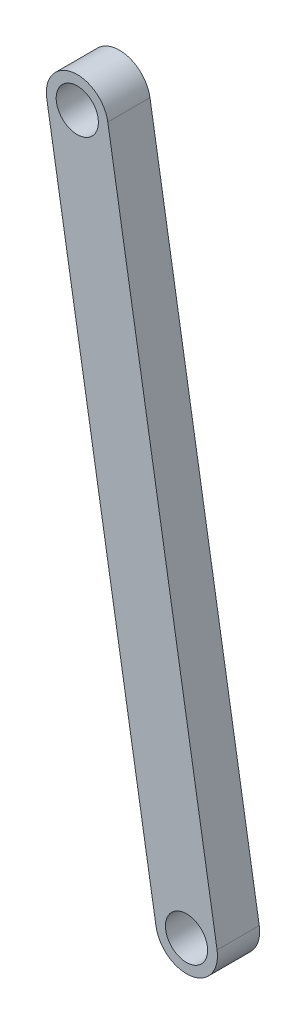
ISO-10303-21;
HEADER;
FILE_DESCRIPTION(('STEP AP214'),'2;1');
FILE_NAME('part.step','',(''),(''),'','','');
FILE_SCHEMA(('AUTOMOTIVE_DESIGN { 1 0 10303 214 1 1 1 1 }'));
ENDSEC;
DATA;
#1=APPLICATION_CONTEXT('core data for automotive mechanical design processes');
#2=APPLICATION_PROTOCOL_DEFINITION('international standard','automotive_design',2000,#1);
#3=PRODUCT_CONTEXT('',#1,'mechanical');
#4=PRODUCT('Part','Part','',(#3));
#5=PRODUCT_RELATED_PRODUCT_CATEGORY('part','',(#4));
#6=PRODUCT_DEFINITION_FORMATION('','',#4);
#7=PRODUCT_DEFINITION_CONTEXT('part definition',#1,'design');
#8=PRODUCT_DEFINITION('design','',#6,#7);
#9=PRODUCT_DEFINITION_SHAPE('','',#8);
#10=(LENGTH_UNIT() NAMED_UNIT(*) SI_UNIT(.MILLI.,.METRE.));
#11=(NAMED_UNIT(*) PLANE_ANGLE_UNIT() SI_UNIT($,.RADIAN.));
#12=(NAMED_UNIT(*) SI_UNIT($,.STERADIAN.) SOLID_ANGLE_UNIT());
#13=UNCERTAINTY_MEASURE_WITH_UNIT(LENGTH_MEASURE(1.E-05),#10,'distance_accuracy_value','');
#14=(GEOMETRIC_REPRESENTATION_CONTEXT(3) GLOBAL_UNCERTAINTY_ASSIGNED_CONTEXT((#13)) GLOBAL_UNIT_ASSIGNED_CONTEXT((#10,
#11,#12)) REPRESENTATION_CONTEXT('',''));
#15=CARTESIAN_POINT('',(0.,0.,0.));
#16=DIRECTION('',(0.,0.,1.));
#17=DIRECTION('',(1.,0.,0.));
#18=AXIS2_PLACEMENT_3D('',#15,#16,#17);
#19=CARTESIAN_POINT('',(0.,0.,3.));
#20=DIRECTION('',(0.,0.,1.));
#21=DIRECTION('',(1.,0.,0.));
#22=AXIS2_PLACEMENT_3D('',#19,#20,#21);
#23=PLANE('',#22);
#24=CARTESIAN_POINT('',(0.,0.,3.));
#25=DIRECTION('',(0.,0.,1.));
#26=DIRECTION('',(1.,0.,0.));
#27=AXIS2_PLACEMENT_3D('',#24,#25,#26);
#28=CIRCLE('',#27,1.5);
#29=CARTESIAN_POINT('',(1.5,0.,3.));
#30=VERTEX_POINT('',#29);
#31=EDGE_CURVE('E108',#30,#30,#28,.T.);
#32=ORIENTED_EDGE('',*,*,#31,.F.);
#33=EDGE_LOOP('',(#32));
#34=FACE_BOUND('',#33,.T.);
#35=CARTESIAN_POINT('',(0.,0.,3.));
#36=DIRECTION('',(0.,0.,1.));
#37=DIRECTION('',(1.,0.,0.));
#38=AXIS2_PLACEMENT_3D('',#35,#36,#37);
#39=CIRCLE('',#38,2.2);
#40=CARTESIAN_POINT('',(2.17066154290129,0.358090025230214,3.));
#41=VERTEX_POINT('',#40);
#42=CARTESIAN_POINT('',(-2.1706615429013,-0.358090025230214,3.));
#43=VERTEX_POINT('',#42);
#44=EDGE_CURVE('E93',#41,#43,#39,.T.);
#45=ORIENTED_EDGE('',*,*,#44,.T.);
#46=DIRECTION('',(0.162768193286461,-0.986664337682406,0.));
#47=VECTOR('',#46,1.);
#48=CARTESIAN_POINT('',(-2.1706615429013,-0.358090025230214,3.));
#49=LINE('',#48,#47);
#50=CARTESIAN_POINT('',(5.59933845709871,-47.4580900252302,3.));
#51=VERTEX_POINT('',#50);
#52=EDGE_CURVE('E88',#43,#51,#49,.T.);
#53=ORIENTED_EDGE('',*,*,#52,.T.);
#54=CARTESIAN_POINT('',(7.77000000000001,-47.1,3.));
#55=DIRECTION('',(0.,0.,1.));
#56=DIRECTION('',(1.,0.,0.));
#57=AXIS2_PLACEMENT_3D('',#54,#55,#56);
#58=CIRCLE('',#57,2.2);
#59=CARTESIAN_POINT('',(9.9406615429013,-46.7419099747698,3.));
#60=VERTEX_POINT('',#59);
#61=EDGE_CURVE('E91',#51,#60,#58,.T.);
#62=ORIENTED_EDGE('',*,*,#61,.T.);
#63=DIRECTION('',(-0.162768193286461,0.986664337682406,0.));
#64=VECTOR('',#63,1.);
#65=CARTESIAN_POINT('',(2.17066154290129,0.358090025230214,3.));
#66=LINE('',#65,#64);
#67=EDGE_CURVE('E58',#60,#41,#66,.T.);
#68=ORIENTED_EDGE('',*,*,#67,.T.);
#69=EDGE_LOOP('',(#45,#53,#62,#68));
#70=FACE_BOUND('',#69,.T.);
#71=CARTESIAN_POINT('',(7.77000000000001,-47.1,3.));
#72=DIRECTION('',(0.,0.,1.));
#73=DIRECTION('',(1.,0.,0.));
#74=AXIS2_PLACEMENT_3D('',#71,#72,#73);
#75=CIRCLE('',#74,1.5);
#76=CARTESIAN_POINT('',(9.27000000000001,-47.1,3.));
#77=VERTEX_POINT('',#76);
#78=EDGE_CURVE('E123',#77,#77,#75,.T.);
#79=ORIENTED_EDGE('',*,*,#78,.F.);
#80=EDGE_LOOP('',(#79));
#81=FACE_BOUND('',#80,.T.);
#82=ADVANCED_FACE('F41',(#34,#70,#81),#23,.T.);
#83=CARTESIAN_POINT('',(0.,0.,0.));
#84=DIRECTION('',(0.,0.,1.));
#85=DIRECTION('',(1.,0.,0.));
#86=AXIS2_PLACEMENT_3D('',#83,#84,#85);
#87=PLANE('',#86);
#88=CARTESIAN_POINT('',(0.,0.,0.));
#89=DIRECTION('',(0.,0.,1.));
#90=DIRECTION('',(1.,0.,0.));
#91=AXIS2_PLACEMENT_3D('',#88,#89,#90);
#92=CIRCLE('',#91,2.2);
#93=CARTESIAN_POINT('',(2.17066154290129,0.358090025230214,0.));
#94=VERTEX_POINT('',#93);
#95=CARTESIAN_POINT('',(-2.1706615429013,-0.358090025230214,0.));
#96=VERTEX_POINT('',#95);
#97=EDGE_CURVE('E105',#94,#96,#92,.T.);
#98=ORIENTED_EDGE('',*,*,#97,.F.);
#99=DIRECTION('',(-0.162768193286461,0.986664337682406,0.));
#100=VECTOR('',#99,1.);
#101=CARTESIAN_POINT('',(2.17066154290129,0.358090025230214,0.));
#102=LINE('',#101,#100);
#103=CARTESIAN_POINT('',(9.9406615429013,-46.7419099747698,0.));
#104=VERTEX_POINT('',#103);
#105=EDGE_CURVE('E81',#104,#94,#102,.T.);
#106=ORIENTED_EDGE('',*,*,#105,.F.);
#107=CARTESIAN_POINT('',(7.77000000000001,-47.1,0.));
#108=DIRECTION('',(0.,0.,1.));
#109=DIRECTION('',(1.,0.,0.));
#110=AXIS2_PLACEMENT_3D('',#107,#108,#109);
#111=CIRCLE('',#110,2.2);
#112=CARTESIAN_POINT('',(5.59933845709871,-47.4580900252302,0.));
#113=VERTEX_POINT('',#112);
#114=EDGE_CURVE('E75',#113,#104,#111,.T.);
#115=ORIENTED_EDGE('',*,*,#114,.F.);
#116=DIRECTION('',(0.162768193286461,-0.986664337682406,0.));
#117=VECTOR('',#116,1.);
#118=CARTESIAN_POINT('',(-2.1706615429013,-0.358090025230214,0.));
#119=LINE('',#118,#117);
#120=EDGE_CURVE('E97',#96,#113,#119,.T.);
#121=ORIENTED_EDGE('',*,*,#120,.F.);
#122=EDGE_LOOP('',(#98,#106,#115,#121));
#123=FACE_BOUND('',#122,.T.);
#124=CARTESIAN_POINT('',(0.,0.,0.));
#125=DIRECTION('',(0.,0.,1.));
#126=DIRECTION('',(1.,0.,0.));
#127=AXIS2_PLACEMENT_3D('',#124,#125,#126);
#128=CIRCLE('',#127,1.5);
#129=CARTESIAN_POINT('',(1.5,0.,0.));
#130=VERTEX_POINT('',#129);
#131=EDGE_CURVE('E120',#130,#130,#128,.T.);
#132=ORIENTED_EDGE('',*,*,#131,.T.);
#133=EDGE_LOOP('',(#132));
#134=FACE_BOUND('',#133,.T.);
#135=CARTESIAN_POINT('',(7.77000000000001,-47.1,0.));
#136=DIRECTION('',(0.,0.,1.));
#137=DIRECTION('',(1.,0.,0.));
#138=AXIS2_PLACEMENT_3D('',#135,#136,#137);
#139=CIRCLE('',#138,1.5);
#140=CARTESIAN_POINT('',(9.27000000000001,-47.1,0.));
#141=VERTEX_POINT('',#140);
#142=EDGE_CURVE('E126',#141,#141,#139,.T.);
#143=ORIENTED_EDGE('',*,*,#142,.T.);
#144=EDGE_LOOP('',(#143));
#145=FACE_BOUND('',#144,.T.);
#146=ADVANCED_FACE('F116',(#123,#134,#145),#87,.F.);
#147=CARTESIAN_POINT('',(0.,0.,3.));
#148=DIRECTION('',(0.,0.,-1.));
#149=DIRECTION('',(-1.,0.,0.));
#150=AXIS2_PLACEMENT_3D('',#147,#148,#149);
#151=CYLINDRICAL_SURFACE('',#150,2.2);
#152=ORIENTED_EDGE('',*,*,#97,.T.);
#153=DIRECTION('',(0.,0.,-1.));
#154=VECTOR('',#153,1.);
#155=CARTESIAN_POINT('',(-2.1706615429013,-0.358090025230214,3.));
#156=LINE('',#155,#154);
#157=EDGE_CURVE('E11',#43,#96,#156,.T.);
#158=ORIENTED_EDGE('',*,*,#157,.F.);
#159=ORIENTED_EDGE('',*,*,#44,.F.);
#160=DIRECTION('',(0.,0.,-1.));
#161=VECTOR('',#160,1.);
#162=CARTESIAN_POINT('',(2.17066154290129,0.358090025230214,3.));
#163=LINE('',#162,#161);
#164=EDGE_CURVE('E101',#41,#94,#163,.T.);
#165=ORIENTED_EDGE('',*,*,#164,.T.);
#166=EDGE_LOOP('',(#152,#158,#159,#165));
#167=FACE_BOUND('',#166,.T.);
#168=ADVANCED_FACE('F43',(#167),#151,.T.);
#169=CARTESIAN_POINT('',(-2.1706615429013,-0.358090025230214,3.));
#170=DIRECTION('',(0.986664337682406,0.162768193286461,0.));
#171=DIRECTION('',(-0.162768193286461,0.986664337682406,0.));
#172=AXIS2_PLACEMENT_3D('',#169,#170,#171);
#173=PLANE('',#172);
#174=ORIENTED_EDGE('',*,*,#120,.T.);
#175=DIRECTION('',(0.,0.,-1.));
#176=VECTOR('',#175,1.);
#177=CARTESIAN_POINT('',(5.59933845709871,-47.4580900252302,3.));
#178=LINE('',#177,#176);
#179=EDGE_CURVE('E50',#51,#113,#178,.T.);
#180=ORIENTED_EDGE('',*,*,#179,.F.);
#181=ORIENTED_EDGE('',*,*,#52,.F.);
#182=ORIENTED_EDGE('',*,*,#157,.T.);
#183=EDGE_LOOP('',(#174,#180,#181,#182));
#184=FACE_BOUND('',#183,.T.);
#185=ADVANCED_FACE('F96',(#184),#173,.F.);
#186=CARTESIAN_POINT('',(7.77000000000001,-47.1,3.));
#187=DIRECTION('',(0.,0.,-1.));
#188=DIRECTION('',(-1.,0.,0.));
#189=AXIS2_PLACEMENT_3D('',#186,#187,#188);
#190=CYLINDRICAL_SURFACE('',#189,2.2);
#191=ORIENTED_EDGE('',*,*,#114,.T.);
#192=DIRECTION('',(0.,0.,-1.));
#193=VECTOR('',#192,1.);
#194=CARTESIAN_POINT('',(9.9406615429013,-46.7419099747698,3.));
#195=LINE('',#194,#193);
#196=EDGE_CURVE('E98',#60,#104,#195,.T.);
#197=ORIENTED_EDGE('',*,*,#196,.F.);
#198=ORIENTED_EDGE('',*,*,#61,.F.);
#199=ORIENTED_EDGE('',*,*,#179,.T.);
#200=EDGE_LOOP('',(#191,#197,#198,#199));
#201=FACE_BOUND('',#200,.T.);
#202=ADVANCED_FACE('F99',(#201),#190,.T.);
#203=CARTESIAN_POINT('',(2.17066154290129,0.358090025230214,3.));
#204=DIRECTION('',(-0.986664337682406,-0.162768193286461,0.));
#205=DIRECTION('',(0.162768193286461,-0.986664337682406,0.));
#206=AXIS2_PLACEMENT_3D('',#203,#204,#205);
#207=PLANE('',#206);
#208=ORIENTED_EDGE('',*,*,#105,.T.);
#209=ORIENTED_EDGE('',*,*,#164,.F.);
#210=ORIENTED_EDGE('',*,*,#67,.F.);
#211=ORIENTED_EDGE('',*,*,#196,.T.);
#212=EDGE_LOOP('',(#208,#209,#210,#211));
#213=FACE_BOUND('',#212,.T.);
#214=ADVANCED_FACE('F113',(#213),#207,.F.);
#215=CARTESIAN_POINT('',(0.,0.,3.));
#216=DIRECTION('',(0.,0.,-1.));
#217=DIRECTION('',(-1.,0.,0.));
#218=AXIS2_PLACEMENT_3D('',#215,#216,#217);
#219=CYLINDRICAL_SURFACE('',#218,1.5);
#220=ORIENTED_EDGE('',*,*,#31,.T.);
#221=EDGE_LOOP('',(#220));
#222=FACE_BOUND('',#221,.T.);
#223=ORIENTED_EDGE('',*,*,#131,.F.);
#224=EDGE_LOOP('',(#223));
#225=FACE_BOUND('',#224,.T.);
#226=ADVANCED_FACE('F143',(#222,#225),#219,.F.);
#227=CARTESIAN_POINT('',(7.77000000000001,-47.1,3.));
#228=DIRECTION('',(0.,0.,-1.));
#229=DIRECTION('',(-1.,0.,0.));
#230=AXIS2_PLACEMENT_3D('',#227,#228,#229);
#231=CYLINDRICAL_SURFACE('',#230,1.5);
#232=ORIENTED_EDGE('',*,*,#78,.T.);
#233=EDGE_LOOP('',(#232));
#234=FACE_BOUND('',#233,.T.);
#235=ORIENTED_EDGE('',*,*,#142,.F.);
#236=EDGE_LOOP('',(#235));
#237=FACE_BOUND('',#236,.T.);
#238=ADVANCED_FACE('F132',(#234,#237),#231,.F.);
#239=CLOSED_SHELL('',(#82,#146,#168,#185,#202,#214,#226,#238));
#240=MANIFOLD_SOLID_BREP('B2',#239);
#241=ADVANCED_BREP_SHAPE_REPRESENTATION('',(#18,#240),#14);
#242=SHAPE_DEFINITION_REPRESENTATION(#9,#241);
ENDSEC;
END-ISO-10303-21;
